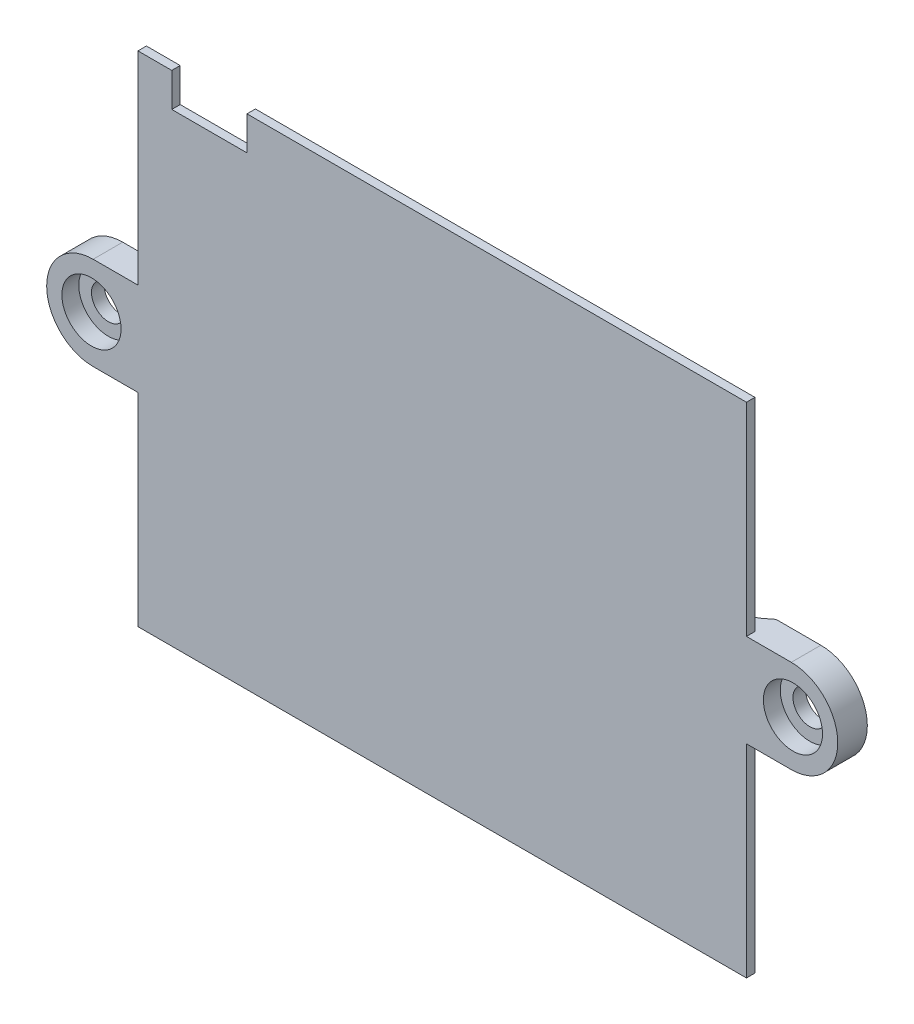
ISO-10303-21;
HEADER;
FILE_DESCRIPTION(('STEP AP214'),'2;1');
FILE_NAME('part.step','',(''),(''),'','','');
FILE_SCHEMA(('AUTOMOTIVE_DESIGN { 1 0 10303 214 1 1 1 1 }'));
ENDSEC;
DATA;
#1=APPLICATION_CONTEXT('core data for automotive mechanical design processes');
#2=APPLICATION_PROTOCOL_DEFINITION('international standard','automotive_design',2000,#1);
#3=PRODUCT_CONTEXT('',#1,'mechanical');
#4=PRODUCT('Part','Part','',(#3));
#5=PRODUCT_RELATED_PRODUCT_CATEGORY('part','',(#4));
#6=PRODUCT_DEFINITION_FORMATION('','',#4);
#7=PRODUCT_DEFINITION_CONTEXT('part definition',#1,'design');
#8=PRODUCT_DEFINITION('design','',#6,#7);
#9=PRODUCT_DEFINITION_SHAPE('','',#8);
#10=(LENGTH_UNIT() NAMED_UNIT(*) SI_UNIT(.MILLI.,.METRE.));
#11=(NAMED_UNIT(*) PLANE_ANGLE_UNIT() SI_UNIT($,.RADIAN.));
#12=(NAMED_UNIT(*) SI_UNIT($,.STERADIAN.) SOLID_ANGLE_UNIT());
#13=UNCERTAINTY_MEASURE_WITH_UNIT(LENGTH_MEASURE(1.E-05),#10,'distance_accuracy_value','');
#14=(GEOMETRIC_REPRESENTATION_CONTEXT(3) GLOBAL_UNCERTAINTY_ASSIGNED_CONTEXT((#13)) GLOBAL_UNIT_ASSIGNED_CONTEXT((#10,
#11,#12)) REPRESENTATION_CONTEXT('',''));
#15=CARTESIAN_POINT('',(0.,0.,0.));
#16=DIRECTION('',(0.,0.,1.));
#17=DIRECTION('',(1.,0.,0.));
#18=AXIS2_PLACEMENT_3D('',#15,#16,#17);
#19=CARTESIAN_POINT('',(-108.711042912636,7.30000000000003,-15.4155765380345));
#20=DIRECTION('',(0.,0.,1.));
#21=DIRECTION('',(1.,0.,0.));
#22=AXIS2_PLACEMENT_3D('',#19,#20,#21);
#23=CYLINDRICAL_SURFACE('',#22,2.);
#24=CARTESIAN_POINT('',(-108.711042912636,7.30000000000003,0.500000000000013));
#25=DIRECTION('',(0.,0.,1.));
#26=DIRECTION('',(1.,0.,0.));
#27=AXIS2_PLACEMENT_3D('',#24,#25,#26);
#28=CIRCLE('',#27,2.);
#29=CARTESIAN_POINT('',(-106.711042912636,7.30000000000003,0.500000000000013));
#30=VERTEX_POINT('',#29);
#31=EDGE_CURVE('E271',#30,#30,#28,.T.);
#32=CARTESIAN_POINT('',(-108.711042912636,7.30000000000003,2.00000000000001));
#33=DIRECTION('',(0.,0.,1.));
#34=DIRECTION('',(1.,0.,0.));
#35=AXIS2_PLACEMENT_3D('',#32,#33,#34);
#36=CIRCLE('',#35,2.);
#37=CARTESIAN_POINT('',(-106.711042912636,7.30000000000003,2.00000000000001));
#38=VERTEX_POINT('',#37);
#39=EDGE_CURVE('E68',#38,#38,#36,.T.);
#40=CARTESIAN_POINT('',(-106.711042912636,7.30000000000003,0.500000000000013));
#41=CARTESIAN_POINT('',(-106.711042912636,7.30000000000003,0.515625000000013));
#42=CARTESIAN_POINT('',(-106.711042912636,7.30000000000003,0.531250000000014));
#43=CARTESIAN_POINT('',(-106.711042912636,7.30000000000003,0.562500000000014));
#44=CARTESIAN_POINT('',(-106.711042912636,7.30000000000003,0.578125000000013));
#45=CARTESIAN_POINT('',(-106.711042912636,7.30000000000003,0.609375000000012));
#46=CARTESIAN_POINT('',(-106.711042912636,7.30000000000003,0.625000000000012));
#47=CARTESIAN_POINT('',(-106.711042912636,7.30000000000003,0.656250000000012));
#48=CARTESIAN_POINT('',(-106.711042912636,7.30000000000003,0.671875000000012));
#49=CARTESIAN_POINT('',(-106.711042912636,7.30000000000003,0.703125000000013));
#50=CARTESIAN_POINT('',(-106.711042912636,7.30000000000003,0.718750000000014));
#51=CARTESIAN_POINT('',(-106.711042912636,7.30000000000003,0.750000000000014));
#52=CARTESIAN_POINT('',(-106.711042912636,7.30000000000003,0.765625000000013));
#53=CARTESIAN_POINT('',(-106.711042912636,7.30000000000003,0.796875000000012));
#54=CARTESIAN_POINT('',(-106.711042912636,7.30000000000003,0.812500000000012));
#55=CARTESIAN_POINT('',(-106.711042912636,7.30000000000003,0.843750000000012));
#56=CARTESIAN_POINT('',(-106.711042912636,7.30000000000003,0.859375000000012));
#57=CARTESIAN_POINT('',(-106.711042912636,7.30000000000003,0.890625000000013));
#58=CARTESIAN_POINT('',(-106.711042912636,7.30000000000003,0.906250000000014));
#59=CARTESIAN_POINT('',(-106.711042912636,7.30000000000003,0.937500000000014));
#60=CARTESIAN_POINT('',(-106.711042912636,7.30000000000003,0.953125000000014));
#61=CARTESIAN_POINT('',(-106.711042912636,7.30000000000003,0.984375000000012));
#62=CARTESIAN_POINT('',(-106.711042912636,7.30000000000003,1.00000000000001));
#63=CARTESIAN_POINT('',(-106.711042912636,7.30000000000003,1.03125000000001));
#64=CARTESIAN_POINT('',(-106.711042912636,7.30000000000003,1.04687500000001));
#65=CARTESIAN_POINT('',(-106.711042912636,7.30000000000003,1.07812500000001));
#66=CARTESIAN_POINT('',(-106.711042912636,7.30000000000003,1.09375000000001));
#67=CARTESIAN_POINT('',(-106.711042912636,7.30000000000003,1.12500000000001));
#68=CARTESIAN_POINT('',(-106.711042912636,7.30000000000003,1.14062500000001));
#69=CARTESIAN_POINT('',(-106.711042912636,7.30000000000003,1.17187500000001));
#70=CARTESIAN_POINT('',(-106.711042912636,7.30000000000003,1.18750000000001));
#71=CARTESIAN_POINT('',(-106.711042912636,7.30000000000003,1.21875000000001));
#72=CARTESIAN_POINT('',(-106.711042912636,7.30000000000003,1.23437500000001));
#73=CARTESIAN_POINT('',(-106.711042912636,7.30000000000003,1.26562500000001));
#74=CARTESIAN_POINT('',(-106.711042912636,7.30000000000003,1.28125000000001));
#75=CARTESIAN_POINT('',(-106.711042912636,7.30000000000003,1.31250000000001));
#76=CARTESIAN_POINT('',(-106.711042912636,7.30000000000003,1.32812500000001));
#77=CARTESIAN_POINT('',(-106.711042912636,7.30000000000003,1.35937500000001));
#78=CARTESIAN_POINT('',(-106.711042912636,7.30000000000003,1.37500000000001));
#79=CARTESIAN_POINT('',(-106.711042912636,7.30000000000003,1.40625000000001));
#80=CARTESIAN_POINT('',(-106.711042912636,7.30000000000003,1.42187500000001));
#81=CARTESIAN_POINT('',(-106.711042912636,7.30000000000003,1.45312500000001));
#82=CARTESIAN_POINT('',(-106.711042912636,7.30000000000003,1.46875000000001));
#83=CARTESIAN_POINT('',(-106.711042912636,7.30000000000003,1.50000000000001));
#84=CARTESIAN_POINT('',(-106.711042912636,7.30000000000003,1.51562500000001));
#85=CARTESIAN_POINT('',(-106.711042912636,7.30000000000003,1.54687500000001));
#86=CARTESIAN_POINT('',(-106.711042912636,7.30000000000003,1.56250000000001));
#87=CARTESIAN_POINT('',(-106.711042912636,7.30000000000003,1.59375000000001));
#88=CARTESIAN_POINT('',(-106.711042912636,7.30000000000003,1.60937500000001));
#89=CARTESIAN_POINT('',(-106.711042912636,7.30000000000003,1.64062500000001));
#90=CARTESIAN_POINT('',(-106.711042912636,7.30000000000003,1.65625000000001));
#91=CARTESIAN_POINT('',(-106.711042912636,7.30000000000003,1.68750000000001));
#92=CARTESIAN_POINT('',(-106.711042912636,7.30000000000003,1.70312500000001));
#93=CARTESIAN_POINT('',(-106.711042912636,7.30000000000003,1.73437500000001));
#94=CARTESIAN_POINT('',(-106.711042912636,7.30000000000003,1.75000000000001));
#95=CARTESIAN_POINT('',(-106.711042912636,7.30000000000003,1.78125000000001));
#96=CARTESIAN_POINT('',(-106.711042912636,7.30000000000003,1.79687500000001));
#97=CARTESIAN_POINT('',(-106.711042912636,7.30000000000003,1.82812500000001));
#98=CARTESIAN_POINT('',(-106.711042912636,7.30000000000003,1.84375000000001));
#99=CARTESIAN_POINT('',(-106.711042912636,7.30000000000003,1.87500000000001));
#100=CARTESIAN_POINT('',(-106.711042912636,7.30000000000003,1.89062500000001));
#101=CARTESIAN_POINT('',(-106.711042912636,7.30000000000003,1.92187500000001));
#102=CARTESIAN_POINT('',(-106.711042912636,7.30000000000003,1.93750000000001));
#103=CARTESIAN_POINT('',(-106.711042912636,7.30000000000003,1.96875000000001));
#104=CARTESIAN_POINT('',(-106.711042912636,7.30000000000003,1.98437500000001));
#105=CARTESIAN_POINT('',(-106.711042912636,7.30000000000003,2.00000000000001));
#106=B_SPLINE_CURVE_WITH_KNOTS('',3,(#40,#41,#42,#43,#44,#45,#46,#47,#48,#49,#50,#51,#52,#53,
#54,#55,#56,#57,#58,#59,#60,#61,#62,#63,#64,#65,#66,#67,#68,#69,#70,#71,#72,#73,#74,#75,#76,#77,
#78,#79,#80,#81,#82,#83,#84,#85,#86,#87,#88,#89,#90,#91,#92,#93,#94,#95,#96,#97,#98,#99,#100,
#101,#102,#103,#104,#105),.UNSPECIFIED.,.F.,.F.,(4,2,2,2,2,2,2,2,2,2,2,2,2,2,2,2,2,2,2,2,2,2,2,
2,2,2,2,2,2,2,2,2,4),(0.,0.0468750000000018,0.0937500000000001,0.140624999999998,0.1875,
0.234375000000002,0.28125,0.328124999999999,0.375,0.421875000000002,0.46875,0.515624999999999,
0.5625,0.609375000000002,0.656250000000001,0.703124999999999,0.750000000000001,
0.796875000000002,0.843750000000001,0.890624999999999,0.937500000000001,0.984375000000003,
1.03125,1.078125,1.125,1.171875,1.21875,1.265625,1.3125,1.359375,1.40625,1.453125,1.5),.UNSPECIFIED.);
#107=EDGE_CURVE('BSEAM64',#30,#38,#106,.T.);
#108=ORIENTED_EDGE('',*,*,#31,.F.);
#109=ORIENTED_EDGE('',*,*,#39,.T.);
#110=ORIENTED_EDGE('',*,*,#107,.T.);
#111=ORIENTED_EDGE('',*,*,#107,.F.);
#112=EDGE_LOOP('',(#108,#110,#109,#111));
#113=FACE_BOUND('',#112,.T.);
#114=ADVANCED_FACE('F64',(#113),#23,.F.);
#115=CARTESIAN_POINT('',(-25.7110429126358,7.30000000000003,-15.4155765380345));
#116=DIRECTION('',(0.,0.,1.));
#117=DIRECTION('',(1.,0.,0.));
#118=AXIS2_PLACEMENT_3D('',#115,#116,#117);
#119=CYLINDRICAL_SURFACE('',#118,2.);
#120=CARTESIAN_POINT('',(-25.7110429126358,7.30000000000003,0.500000000000014));
#121=DIRECTION('',(0.,0.,1.));
#122=DIRECTION('',(1.,0.,0.));
#123=AXIS2_PLACEMENT_3D('',#120,#121,#122);
#124=CIRCLE('',#123,2.);
#125=CARTESIAN_POINT('',(-23.7110429126358,7.30000000000003,0.500000000000011));
#126=VERTEX_POINT('',#125);
#127=EDGE_CURVE('E224',#126,#126,#124,.T.);
#128=CARTESIAN_POINT('',(-25.7110429126358,7.30000000000003,2.00000000000002));
#129=DIRECTION('',(0.,0.,1.));
#130=DIRECTION('',(1.,0.,0.));
#131=AXIS2_PLACEMENT_3D('',#128,#129,#130);
#132=CIRCLE('',#131,2.);
#133=CARTESIAN_POINT('',(-23.7110429126358,7.30000000000003,2.00000000000001));
#134=VERTEX_POINT('',#133);
#135=EDGE_CURVE('E356',#134,#134,#132,.T.);
#136=CARTESIAN_POINT('',(-23.7110429126358,7.30000000000003,0.500000000000011));
#137=CARTESIAN_POINT('',(-23.7110429126358,7.30000000000003,0.515625000000011));
#138=CARTESIAN_POINT('',(-23.7110429126358,7.30000000000003,0.531250000000012));
#139=CARTESIAN_POINT('',(-23.7110429126358,7.30000000000003,0.562500000000012));
#140=CARTESIAN_POINT('',(-23.7110429126358,7.30000000000003,0.578125000000011));
#141=CARTESIAN_POINT('',(-23.7110429126358,7.30000000000003,0.60937500000001));
#142=CARTESIAN_POINT('',(-23.7110429126358,7.30000000000003,0.62500000000001));
#143=CARTESIAN_POINT('',(-23.7110429126358,7.30000000000003,0.65625000000001));
#144=CARTESIAN_POINT('',(-23.7110429126358,7.30000000000003,0.67187500000001));
#145=CARTESIAN_POINT('',(-23.7110429126358,7.30000000000003,0.703125000000012));
#146=CARTESIAN_POINT('',(-23.7110429126358,7.30000000000003,0.718750000000012));
#147=CARTESIAN_POINT('',(-23.7110429126358,7.30000000000003,0.750000000000012));
#148=CARTESIAN_POINT('',(-23.7110429126358,7.30000000000003,0.765625000000012));
#149=CARTESIAN_POINT('',(-23.7110429126358,7.30000000000003,0.796875000000011));
#150=CARTESIAN_POINT('',(-23.7110429126358,7.30000000000003,0.81250000000001));
#151=CARTESIAN_POINT('',(-23.7110429126358,7.30000000000003,0.84375000000001));
#152=CARTESIAN_POINT('',(-23.7110429126358,7.30000000000003,0.859375000000011));
#153=CARTESIAN_POINT('',(-23.7110429126358,7.30000000000003,0.890625000000012));
#154=CARTESIAN_POINT('',(-23.7110429126358,7.30000000000003,0.906250000000012));
#155=CARTESIAN_POINT('',(-23.7110429126358,7.30000000000003,0.937500000000012));
#156=CARTESIAN_POINT('',(-23.7110429126358,7.30000000000003,0.953125000000012));
#157=CARTESIAN_POINT('',(-23.7110429126358,7.30000000000003,0.984375000000011));
#158=CARTESIAN_POINT('',(-23.7110429126358,7.30000000000003,1.00000000000001));
#159=CARTESIAN_POINT('',(-23.7110429126358,7.30000000000003,1.03125000000001));
#160=CARTESIAN_POINT('',(-23.7110429126358,7.30000000000003,1.04687500000001));
#161=CARTESIAN_POINT('',(-23.7110429126358,7.30000000000003,1.07812500000001));
#162=CARTESIAN_POINT('',(-23.7110429126358,7.30000000000003,1.09375000000001));
#163=CARTESIAN_POINT('',(-23.7110429126358,7.30000000000003,1.12500000000001));
#164=CARTESIAN_POINT('',(-23.7110429126358,7.30000000000003,1.14062500000001));
#165=CARTESIAN_POINT('',(-23.7110429126358,7.30000000000003,1.17187500000001));
#166=CARTESIAN_POINT('',(-23.7110429126358,7.30000000000003,1.18750000000001));
#167=CARTESIAN_POINT('',(-23.7110429126358,7.30000000000003,1.21875000000001));
#168=CARTESIAN_POINT('',(-23.7110429126358,7.30000000000003,1.23437500000001));
#169=CARTESIAN_POINT('',(-23.7110429126358,7.30000000000003,1.26562500000001));
#170=CARTESIAN_POINT('',(-23.7110429126358,7.30000000000003,1.28125000000001));
#171=CARTESIAN_POINT('',(-23.7110429126358,7.30000000000003,1.31250000000001));
#172=CARTESIAN_POINT('',(-23.7110429126358,7.30000000000003,1.32812500000001));
#173=CARTESIAN_POINT('',(-23.7110429126358,7.30000000000003,1.35937500000001));
#174=CARTESIAN_POINT('',(-23.7110429126358,7.30000000000003,1.37500000000001));
#175=CARTESIAN_POINT('',(-23.7110429126358,7.30000000000003,1.40625000000001));
#176=CARTESIAN_POINT('',(-23.7110429126358,7.30000000000003,1.42187500000001));
#177=CARTESIAN_POINT('',(-23.7110429126358,7.30000000000003,1.45312500000001));
#178=CARTESIAN_POINT('',(-23.7110429126358,7.30000000000003,1.46875000000001));
#179=CARTESIAN_POINT('',(-23.7110429126358,7.30000000000003,1.50000000000001));
#180=CARTESIAN_POINT('',(-23.7110429126358,7.30000000000003,1.51562500000001));
#181=CARTESIAN_POINT('',(-23.7110429126358,7.30000000000003,1.54687500000001));
#182=CARTESIAN_POINT('',(-23.7110429126358,7.30000000000003,1.56250000000001));
#183=CARTESIAN_POINT('',(-23.7110429126358,7.30000000000003,1.59375000000001));
#184=CARTESIAN_POINT('',(-23.7110429126358,7.30000000000003,1.60937500000001));
#185=CARTESIAN_POINT('',(-23.7110429126358,7.30000000000003,1.64062500000001));
#186=CARTESIAN_POINT('',(-23.7110429126358,7.30000000000003,1.65625000000001));
#187=CARTESIAN_POINT('',(-23.7110429126358,7.30000000000003,1.68750000000001));
#188=CARTESIAN_POINT('',(-23.7110429126358,7.30000000000003,1.70312500000001));
#189=CARTESIAN_POINT('',(-23.7110429126358,7.30000000000003,1.73437500000001));
#190=CARTESIAN_POINT('',(-23.7110429126358,7.30000000000003,1.75000000000001));
#191=CARTESIAN_POINT('',(-23.7110429126358,7.30000000000003,1.78125000000001));
#192=CARTESIAN_POINT('',(-23.7110429126358,7.30000000000003,1.79687500000001));
#193=CARTESIAN_POINT('',(-23.7110429126358,7.30000000000003,1.82812500000001));
#194=CARTESIAN_POINT('',(-23.7110429126358,7.30000000000003,1.84375000000001));
#195=CARTESIAN_POINT('',(-23.7110429126358,7.30000000000003,1.87500000000001));
#196=CARTESIAN_POINT('',(-23.7110429126358,7.30000000000003,1.89062500000001));
#197=CARTESIAN_POINT('',(-23.7110429126358,7.30000000000003,1.92187500000001));
#198=CARTESIAN_POINT('',(-23.7110429126358,7.30000000000003,1.93750000000001));
#199=CARTESIAN_POINT('',(-23.7110429126358,7.30000000000003,1.96875000000001));
#200=CARTESIAN_POINT('',(-23.7110429126358,7.30000000000003,1.98437500000001));
#201=CARTESIAN_POINT('',(-23.7110429126358,7.30000000000003,2.00000000000001));
#202=B_SPLINE_CURVE_WITH_KNOTS('',3,(#136,#137,#138,#139,#140,#141,#142,#143,#144,#145,#146,
#147,#148,#149,#150,#151,#152,#153,#154,#155,#156,#157,#158,#159,#160,#161,#162,#163,#164,#165,
#166,#167,#168,#169,#170,#171,#172,#173,#174,#175,#176,#177,#178,#179,#180,#181,#182,#183,#184,
#185,#186,#187,#188,#189,#190,#191,#192,#193,#194,#195,#196,#197,#198,#199,#200,#201),
.UNSPECIFIED.,.F.,.F.,(4,2,2,2,2,2,2,2,2,2,2,2,2,2,2,2,2,2,2,2,2,2,2,2,2,2,2,2,2,2,2,2,4),(0.,
0.0468750000000018,0.0937500000000001,0.140624999999998,0.1875,0.234375000000002,0.28125,
0.328124999999999,0.375,0.421875000000002,0.46875,0.515624999999999,0.5625,0.609375000000002,
0.656250000000001,0.703124999999999,0.750000000000001,0.796875000000002,0.843750000000001,
0.890624999999999,0.937500000000001,0.984375000000003,1.03125,1.078125,1.125,1.171875,1.21875,
1.265625,1.3125,1.359375,1.40625,1.453125,1.5),.UNSPECIFIED.);
#203=EDGE_CURVE('BSEAM457',#126,#134,#202,.T.);
#204=ORIENTED_EDGE('',*,*,#127,.F.);
#205=ORIENTED_EDGE('',*,*,#135,.T.);
#206=ORIENTED_EDGE('',*,*,#203,.T.);
#207=ORIENTED_EDGE('',*,*,#203,.F.);
#208=EDGE_LOOP('',(#204,#206,#205,#207));
#209=FACE_BOUND('',#208,.T.);
#210=ADVANCED_FACE('F457',(#209),#119,.F.);
#211=CARTESIAN_POINT('',(-31.2110429126358,38.49011,3.00000000000001));
#212=DIRECTION('',(1.,0.,0.));
#213=DIRECTION('',(0.,0.,-1.));
#214=AXIS2_PLACEMENT_3D('',#211,#212,#213);
#215=PLANE('',#214);
#216=DIRECTION('',(0.,1.,0.));
#217=VECTOR('',#216,1.);
#218=CARTESIAN_POINT('',(-31.2110429126358,38.49011,3.00000000000001));
#219=LINE('',#218,#217);
#220=CARTESIAN_POINT('',(-31.2110429126358,-22.2,3.00000000000001));
#221=VERTEX_POINT('',#220);
#222=CARTESIAN_POINT('',(-31.2110429126358,1.80000000000004,3.));
#223=VERTEX_POINT('',#222);
#224=EDGE_CURVE('E290',#221,#223,#219,.T.);
#225=ORIENTED_EDGE('',*,*,#224,.T.);
#226=DIRECTION('',(0.,0.,1.));
#227=VECTOR('',#226,1.);
#228=CARTESIAN_POINT('',(-31.2110429126358,1.80000000000004,-15.4155765380345));
#229=LINE('',#228,#227);
#230=CARTESIAN_POINT('',(-31.2110429126358,1.80000000000004,4.00000000000001));
#231=VERTEX_POINT('',#230);
#232=EDGE_CURVE('E262',#223,#231,#229,.T.);
#233=ORIENTED_EDGE('',*,*,#232,.T.);
#234=DIRECTION('',(0.,1.,0.));
#235=VECTOR('',#234,1.);
#236=CARTESIAN_POINT('',(-31.2110429126358,38.49011,4.00000000000001));
#237=LINE('',#236,#235);
#238=CARTESIAN_POINT('',(-31.2110429126358,-22.2,4.00000000000001));
#239=VERTEX_POINT('',#238);
#240=EDGE_CURVE('E314',#239,#231,#237,.T.);
#241=ORIENTED_EDGE('',*,*,#240,.F.);
#242=DIRECTION('',(0.,0.,1.));
#243=VECTOR('',#242,1.);
#244=CARTESIAN_POINT('',(-31.2110429126358,-22.2,3.00000000000001));
#245=LINE('',#244,#243);
#246=EDGE_CURVE('E326',#221,#239,#245,.T.);
#247=ORIENTED_EDGE('',*,*,#246,.F.);
#248=EDGE_LOOP('',(#225,#233,#241,#247));
#249=FACE_BOUND('',#248,.T.);
#250=ADVANCED_FACE('F439',(#249),#215,.T.);
#251=CARTESIAN_POINT('',(-103.211042912636,38.49011,3.));
#252=DIRECTION('',(1.,0.,0.));
#253=DIRECTION('',(0.,0.,-1.));
#254=AXIS2_PLACEMENT_3D('',#251,#252,#253);
#255=PLANE('',#254);
#256=DIRECTION('',(0.,0.,1.));
#257=VECTOR('',#256,1.);
#258=CARTESIAN_POINT('',(-103.211042912636,1.80000000000004,-15.4155765380345));
#259=LINE('',#258,#257);
#260=CARTESIAN_POINT('',(-103.211042912636,1.80000000000004,3.));
#261=VERTEX_POINT('',#260);
#262=CARTESIAN_POINT('',(-103.211042912636,1.80000000000004,4.));
#263=VERTEX_POINT('',#262);
#264=EDGE_CURVE('E254',#261,#263,#259,.T.);
#265=ORIENTED_EDGE('',*,*,#264,.F.);
#266=DIRECTION('',(0.,1.,0.));
#267=VECTOR('',#266,1.);
#268=CARTESIAN_POINT('',(-103.211042912636,38.49011,3.));
#269=LINE('',#268,#267);
#270=CARTESIAN_POINT('',(-103.211042912636,-22.2,3.));
#271=VERTEX_POINT('',#270);
#272=EDGE_CURVE('E297',#271,#261,#269,.T.);
#273=ORIENTED_EDGE('',*,*,#272,.F.);
#274=DIRECTION('',(0.,0.,1.));
#275=VECTOR('',#274,1.);
#276=CARTESIAN_POINT('',(-103.211042912636,-22.2,3.));
#277=LINE('',#276,#275);
#278=CARTESIAN_POINT('',(-103.211042912636,-22.2,4.));
#279=VERTEX_POINT('',#278);
#280=EDGE_CURVE('E324',#271,#279,#277,.T.);
#281=ORIENTED_EDGE('',*,*,#280,.T.);
#282=DIRECTION('',(0.,1.,0.));
#283=VECTOR('',#282,1.);
#284=CARTESIAN_POINT('',(-103.211042912636,38.49011,4.));
#285=LINE('',#284,#283);
#286=EDGE_CURVE('E279',#279,#263,#285,.T.);
#287=ORIENTED_EDGE('',*,*,#286,.T.);
#288=EDGE_LOOP('',(#265,#273,#281,#287));
#289=FACE_BOUND('',#288,.T.);
#290=ADVANCED_FACE('F433',(#289),#255,.F.);
#291=CARTESIAN_POINT('',(-97.7110429126358,36.8,3.));
#292=DIRECTION('',(0.,-1.,0.));
#293=DIRECTION('',(0.,0.,-1.));
#294=AXIS2_PLACEMENT_3D('',#291,#292,#293);
#295=PLANE('',#294);
#296=DIRECTION('',(1.,0.,0.));
#297=VECTOR('',#296,1.);
#298=CARTESIAN_POINT('',(-97.7110429126358,36.8,4.));
#299=LINE('',#298,#297);
#300=CARTESIAN_POINT('',(-103.211042912636,36.8,4.));
#301=VERTEX_POINT('',#300);
#302=CARTESIAN_POINT('',(-99.2110429126358,36.8,4.));
#303=VERTEX_POINT('',#302);
#304=EDGE_CURVE('E274',#301,#303,#299,.T.);
#305=ORIENTED_EDGE('',*,*,#304,.T.);
#306=DIRECTION('',(0.,0.,1.));
#307=VECTOR('',#306,1.);
#308=CARTESIAN_POINT('',(-99.2110429126358,36.8,3.));
#309=LINE('',#308,#307);
#310=CARTESIAN_POINT('',(-99.2110429126358,36.8,3.));
#311=VERTEX_POINT('',#310);
#312=EDGE_CURVE('E257',#311,#303,#309,.T.);
#313=ORIENTED_EDGE('',*,*,#312,.F.);
#314=DIRECTION('',(1.,0.,0.));
#315=VECTOR('',#314,1.);
#316=CARTESIAN_POINT('',(-97.7110429126358,36.8,3.));
#317=LINE('',#316,#315);
#318=CARTESIAN_POINT('',(-103.211042912636,36.8,3.));
#319=VERTEX_POINT('',#318);
#320=EDGE_CURVE('E275',#319,#311,#317,.T.);
#321=ORIENTED_EDGE('',*,*,#320,.F.);
#322=DIRECTION('',(0.,0.,1.));
#323=VECTOR('',#322,1.);
#324=CARTESIAN_POINT('',(-103.211042912636,36.8,3.));
#325=LINE('',#324,#323);
#326=EDGE_CURVE('E299',#319,#301,#325,.T.);
#327=ORIENTED_EDGE('',*,*,#326,.T.);
#328=EDGE_LOOP('',(#305,#313,#321,#327));
#329=FACE_BOUND('',#328,.T.);
#330=ADVANCED_FACE('F410',(#329),#295,.F.);
#331=CARTESIAN_POINT('',(-99.2110429126358,38.49011,3.));
#332=DIRECTION('',(-1.,0.,0.));
#333=DIRECTION('',(0.,0.,1.));
#334=AXIS2_PLACEMENT_3D('',#331,#332,#333);
#335=PLANE('',#334);
#336=DIRECTION('',(0.,-1.,0.));
#337=VECTOR('',#336,1.);
#338=CARTESIAN_POINT('',(-99.2110429126358,38.49011,4.));
#339=LINE('',#338,#337);
#340=CARTESIAN_POINT('',(-99.2110429126358,32.8,4.));
#341=VERTEX_POINT('',#340);
#342=EDGE_CURVE('E302',#303,#341,#339,.T.);
#343=ORIENTED_EDGE('',*,*,#342,.T.);
#344=DIRECTION('',(0.,0.,1.));
#345=VECTOR('',#344,1.);
#346=CARTESIAN_POINT('',(-99.2110429126358,32.8,3.));
#347=LINE('',#346,#345);
#348=CARTESIAN_POINT('',(-99.2110429126358,32.8,3.));
#349=VERTEX_POINT('',#348);
#350=EDGE_CURVE('E335',#349,#341,#347,.T.);
#351=ORIENTED_EDGE('',*,*,#350,.F.);
#352=DIRECTION('',(0.,-1.,0.));
#353=VECTOR('',#352,1.);
#354=CARTESIAN_POINT('',(-99.2110429126358,38.49011,3.));
#355=LINE('',#354,#353);
#356=EDGE_CURVE('E278',#311,#349,#355,.T.);
#357=ORIENTED_EDGE('',*,*,#356,.F.);
#358=ORIENTED_EDGE('',*,*,#312,.T.);
#359=EDGE_LOOP('',(#343,#351,#357,#358));
#360=FACE_BOUND('',#359,.T.);
#361=ADVANCED_FACE('F407',(#360),#335,.F.);
#362=CARTESIAN_POINT('',(-97.7110429126358,32.8,3.));
#363=DIRECTION('',(0.,-1.,0.));
#364=DIRECTION('',(0.,0.,-1.));
#365=AXIS2_PLACEMENT_3D('',#362,#363,#364);
#366=PLANE('',#365);
#367=DIRECTION('',(1.,0.,0.));
#368=VECTOR('',#367,1.);
#369=CARTESIAN_POINT('',(-97.7110429126358,32.8,4.));
#370=LINE('',#369,#368);
#371=CARTESIAN_POINT('',(-90.3110429126358,32.8,4.));
#372=VERTEX_POINT('',#371);
#373=EDGE_CURVE('E304',#341,#372,#370,.T.);
#374=ORIENTED_EDGE('',*,*,#373,.T.);
#375=DIRECTION('',(0.,0.,1.));
#376=VECTOR('',#375,1.);
#377=CARTESIAN_POINT('',(-90.3110429126358,32.8,3.));
#378=LINE('',#377,#376);
#379=CARTESIAN_POINT('',(-90.3110429126358,32.8,3.));
#380=VERTEX_POINT('',#379);
#381=EDGE_CURVE('E333',#380,#372,#378,.T.);
#382=ORIENTED_EDGE('',*,*,#381,.F.);
#383=DIRECTION('',(1.,0.,0.));
#384=VECTOR('',#383,1.);
#385=CARTESIAN_POINT('',(-97.7110429126358,32.8,3.));
#386=LINE('',#385,#384);
#387=EDGE_CURVE('E281',#349,#380,#386,.T.);
#388=ORIENTED_EDGE('',*,*,#387,.F.);
#389=ORIENTED_EDGE('',*,*,#350,.T.);
#390=EDGE_LOOP('',(#374,#382,#388,#389));
#391=FACE_BOUND('',#390,.T.);
#392=ADVANCED_FACE('F402',(#391),#366,.F.);
#393=CARTESIAN_POINT('',(-90.3110429126358,38.49011,3.));
#394=DIRECTION('',(-1.,0.,0.));
#395=DIRECTION('',(0.,0.,1.));
#396=AXIS2_PLACEMENT_3D('',#393,#394,#395);
#397=PLANE('',#396);
#398=DIRECTION('',(0.,-1.,0.));
#399=VECTOR('',#398,1.);
#400=CARTESIAN_POINT('',(-90.3110429126358,38.49011,4.));
#401=LINE('',#400,#399);
#402=CARTESIAN_POINT('',(-90.3110429126358,36.8,4.));
#403=VERTEX_POINT('',#402);
#404=EDGE_CURVE('E307',#403,#372,#401,.T.);
#405=ORIENTED_EDGE('',*,*,#404,.F.);
#406=DIRECTION('',(0.,0.,1.));
#407=VECTOR('',#406,1.);
#408=CARTESIAN_POINT('',(-90.3110429126358,36.8,3.));
#409=LINE('',#408,#407);
#410=CARTESIAN_POINT('',(-90.3110429126358,36.8,3.));
#411=VERTEX_POINT('',#410);
#412=EDGE_CURVE('E331',#411,#403,#409,.T.);
#413=ORIENTED_EDGE('',*,*,#412,.F.);
#414=DIRECTION('',(0.,-1.,0.));
#415=VECTOR('',#414,1.);
#416=CARTESIAN_POINT('',(-90.3110429126358,38.49011,3.));
#417=LINE('',#416,#415);
#418=EDGE_CURVE('E283',#411,#380,#417,.T.);
#419=ORIENTED_EDGE('',*,*,#418,.T.);
#420=ORIENTED_EDGE('',*,*,#381,.T.);
#421=EDGE_LOOP('',(#405,#413,#419,#420));
#422=FACE_BOUND('',#421,.T.);
#423=ADVANCED_FACE('F397',(#422),#397,.T.);
#424=CARTESIAN_POINT('',(-97.7110429126358,36.8,3.));
#425=DIRECTION('',(0.,-1.,0.));
#426=DIRECTION('',(0.,0.,-1.));
#427=AXIS2_PLACEMENT_3D('',#424,#425,#426);
#428=PLANE('',#427);
#429=DIRECTION('',(1.,0.,0.));
#430=VECTOR('',#429,1.);
#431=CARTESIAN_POINT('',(-97.7110429126358,36.8,4.));
#432=LINE('',#431,#430);
#433=CARTESIAN_POINT('',(-31.2110429126358,36.8,4.00000000000001));
#434=VERTEX_POINT('',#433);
#435=EDGE_CURVE('E310',#403,#434,#432,.T.);
#436=ORIENTED_EDGE('',*,*,#435,.T.);
#437=DIRECTION('',(0.,0.,1.));
#438=VECTOR('',#437,1.);
#439=CARTESIAN_POINT('',(-31.2110429126358,36.8,3.00000000000001));
#440=LINE('',#439,#438);
#441=CARTESIAN_POINT('',(-31.2110429126358,36.8,3.00000000000001));
#442=VERTEX_POINT('',#441);
#443=EDGE_CURVE('E328',#442,#434,#440,.T.);
#444=ORIENTED_EDGE('',*,*,#443,.F.);
#445=DIRECTION('',(1.,0.,0.));
#446=VECTOR('',#445,1.);
#447=CARTESIAN_POINT('',(-97.7110429126358,36.8,3.));
#448=LINE('',#447,#446);
#449=EDGE_CURVE('E286',#411,#442,#448,.T.);
#450=ORIENTED_EDGE('',*,*,#449,.F.);
#451=ORIENTED_EDGE('',*,*,#412,.T.);
#452=EDGE_LOOP('',(#436,#444,#450,#451));
#453=FACE_BOUND('',#452,.T.);
#454=ADVANCED_FACE('F393',(#453),#428,.F.);
#455=DIRECTION('',(0.,0.,1.));
#456=VECTOR('',#455,1.);
#457=CARTESIAN_POINT('',(-31.2110429126358,12.8000000000001,-15.4155765380345));
#458=LINE('',#457,#456);
#459=CARTESIAN_POINT('',(-31.2110429126358,12.8000000000001,3.));
#460=VERTEX_POINT('',#459);
#461=CARTESIAN_POINT('',(-31.2110429126358,12.8000000000001,4.00000000000001));
#462=VERTEX_POINT('',#461);
#463=EDGE_CURVE('E342',#460,#462,#458,.T.);
#464=ORIENTED_EDGE('',*,*,#463,.F.);
#465=EDGE_CURVE('E289',#460,#442,#219,.T.);
#466=ORIENTED_EDGE('',*,*,#465,.T.);
#467=ORIENTED_EDGE('',*,*,#443,.T.);
#468=EDGE_CURVE('E313',#462,#434,#237,.T.);
#469=ORIENTED_EDGE('',*,*,#468,.F.);
#470=EDGE_LOOP('',(#464,#466,#467,#469));
#471=FACE_BOUND('',#470,.T.);
#472=ADVANCED_FACE('F389',(#471),#215,.T.);
#473=CARTESIAN_POINT('',(-97.7110429126358,-22.2,3.));
#474=DIRECTION('',(0.,-1.,0.));
#475=DIRECTION('',(0.,0.,-1.));
#476=AXIS2_PLACEMENT_3D('',#473,#474,#475);
#477=PLANE('',#476);
#478=DIRECTION('',(1.,0.,0.));
#479=VECTOR('',#478,1.);
#480=CARTESIAN_POINT('',(-97.7110429126358,-22.2,4.));
#481=LINE('',#480,#479);
#482=EDGE_CURVE('E317',#279,#239,#481,.T.);
#483=ORIENTED_EDGE('',*,*,#482,.F.);
#484=ORIENTED_EDGE('',*,*,#280,.F.);
#485=DIRECTION('',(1.,0.,0.));
#486=VECTOR('',#485,1.);
#487=CARTESIAN_POINT('',(-97.7110429126358,-22.2,3.));
#488=LINE('',#487,#486);
#489=EDGE_CURVE('E293',#271,#221,#488,.T.);
#490=ORIENTED_EDGE('',*,*,#489,.T.);
#491=ORIENTED_EDGE('',*,*,#246,.T.);
#492=EDGE_LOOP('',(#483,#484,#490,#491));
#493=FACE_BOUND('',#492,.T.);
#494=ADVANCED_FACE('F436',(#493),#477,.T.);
#495=CARTESIAN_POINT('',(-103.211042912636,12.8,3.));
#496=VERTEX_POINT('',#495);
#497=EDGE_CURVE('E296',#496,#319,#269,.T.);
#498=ORIENTED_EDGE('',*,*,#497,.F.);
#499=DIRECTION('',(0.,0.,1.));
#500=VECTOR('',#499,1.);
#501=CARTESIAN_POINT('',(-103.211042912636,12.8,-15.4155765380345));
#502=LINE('',#501,#500);
#503=CARTESIAN_POINT('',(-103.211042912636,12.8,4.));
#504=VERTEX_POINT('',#503);
#505=EDGE_CURVE('E256',#496,#504,#502,.T.);
#506=ORIENTED_EDGE('',*,*,#505,.T.);
#507=EDGE_CURVE('E320',#504,#301,#285,.T.);
#508=ORIENTED_EDGE('',*,*,#507,.T.);
#509=ORIENTED_EDGE('',*,*,#326,.F.);
#510=EDGE_LOOP('',(#498,#506,#508,#509));
#511=FACE_BOUND('',#510,.T.);
#512=ADVANCED_FACE('F414',(#511),#255,.F.);
#513=CARTESIAN_POINT('',(0.,0.,3.00000000000001));
#514=DIRECTION('',(0.,0.,-1.));
#515=DIRECTION('',(-1.,0.,0.));
#516=AXIS2_PLACEMENT_3D('',#513,#514,#515);
#517=PLANE('',#516);
#518=ORIENTED_EDGE('',*,*,#465,.F.);
#519=DIRECTION('',(-1.,0.,0.));
#520=VECTOR('',#519,1.);
#521=CARTESIAN_POINT('',(0.,12.8000000000001,3.00000000000001));
#522=LINE('',#521,#520);
#523=CARTESIAN_POINT('',(-37.8254211902972,12.8000000000001,3.00000000000001));
#524=VERTEX_POINT('',#523);
#525=EDGE_CURVE('E88',#460,#524,#522,.T.);
#526=ORIENTED_EDGE('',*,*,#525,.T.);
#527=DIRECTION('',(0.,1.,0.));
#528=VECTOR('',#527,1.);
#529=CARTESIAN_POINT('',(-37.8254211902972,1.80000000000004,3.00000000000001));
#530=LINE('',#529,#528);
#531=CARTESIAN_POINT('',(-37.8254211902972,1.80000000000005,3.00000000000001));
#532=VERTEX_POINT('',#531);
#533=EDGE_CURVE('E349',#524,#532,#530,.F.);
#534=ORIENTED_EDGE('',*,*,#533,.T.);
#535=DIRECTION('',(1.,0.,0.));
#536=VECTOR('',#535,1.);
#537=CARTESIAN_POINT('',(-97.7110429126357,1.80000000000003,3.));
#538=LINE('',#537,#536);
#539=EDGE_CURVE('E347',#532,#223,#538,.T.);
#540=ORIENTED_EDGE('',*,*,#539,.T.);
#541=ORIENTED_EDGE('',*,*,#224,.F.);
#542=ORIENTED_EDGE('',*,*,#489,.F.);
#543=ORIENTED_EDGE('',*,*,#272,.T.);
#544=DIRECTION('',(1.,0.,0.));
#545=VECTOR('',#544,1.);
#546=CARTESIAN_POINT('',(0.,1.80000000000004,3.00000000000001));
#547=LINE('',#546,#545);
#548=CARTESIAN_POINT('',(-96.5966646349743,1.80000000000004,3.));
#549=VERTEX_POINT('',#548);
#550=EDGE_CURVE('E80',#261,#549,#547,.T.);
#551=ORIENTED_EDGE('',*,*,#550,.T.);
#552=DIRECTION('',(0.,1.,0.));
#553=VECTOR('',#552,1.);
#554=CARTESIAN_POINT('',(-96.5966646349743,12.8,3.));
#555=LINE('',#554,#553);
#556=CARTESIAN_POINT('',(-96.5966646349743,12.8,3.));
#557=VERTEX_POINT('',#556);
#558=EDGE_CURVE('E341',#549,#557,#555,.T.);
#559=ORIENTED_EDGE('',*,*,#558,.T.);
#560=DIRECTION('',(-1.,0.,0.));
#561=VECTOR('',#560,1.);
#562=CARTESIAN_POINT('',(-97.7110429126358,12.8,3.));
#563=LINE('',#562,#561);
#564=EDGE_CURVE('E345',#557,#496,#563,.T.);
#565=ORIENTED_EDGE('',*,*,#564,.T.);
#566=ORIENTED_EDGE('',*,*,#497,.T.);
#567=ORIENTED_EDGE('',*,*,#320,.T.);
#568=ORIENTED_EDGE('',*,*,#356,.T.);
#569=ORIENTED_EDGE('',*,*,#387,.T.);
#570=ORIENTED_EDGE('',*,*,#418,.F.);
#571=ORIENTED_EDGE('',*,*,#449,.T.);
#572=EDGE_LOOP('',(#518,#526,#534,#540,#541,#542,#543,#551,#559,#565,#566,#567,#568,#569,#570,#571));
#573=FACE_BOUND('',#572,.T.);
#574=ADVANCED_FACE('F444',(#573),#517,.T.);
#575=CARTESIAN_POINT('',(0.,0.,4.00000000000002));
#576=DIRECTION('',(0.,0.,-1.));
#577=DIRECTION('',(-1.,0.,0.));
#578=AXIS2_PLACEMENT_3D('',#575,#576,#577);
#579=PLANE('',#578);
#580=CARTESIAN_POINT('',(-108.711042912636,7.30000000000003,4.00000000000002));
#581=DIRECTION('',(0.,0.,1.));
#582=DIRECTION('',(1.,0.,0.));
#583=AXIS2_PLACEMENT_3D('',#580,#581,#582);
#584=CIRCLE('',#583,3.50000000000001);
#585=CARTESIAN_POINT('',(-105.211042912636,7.30000000000003,4.00000000000002));
#586=VERTEX_POINT('',#585);
#587=EDGE_CURVE('E363',#586,#586,#584,.T.);
#588=ORIENTED_EDGE('',*,*,#587,.F.);
#589=EDGE_LOOP('',(#588));
#590=FACE_BOUND('',#589,.T.);
#591=CARTESIAN_POINT('',(-25.7110429126358,7.30000000000003,4.00000000000002));
#592=DIRECTION('',(0.,0.,1.));
#593=DIRECTION('',(1.,0.,0.));
#594=AXIS2_PLACEMENT_3D('',#591,#592,#593);
#595=CIRCLE('',#594,3.5);
#596=CARTESIAN_POINT('',(-22.2110429126358,7.30000000000003,4.00000000000002));
#597=VERTEX_POINT('',#596);
#598=EDGE_CURVE('E373',#597,#597,#595,.T.);
#599=ORIENTED_EDGE('',*,*,#598,.F.);
#600=EDGE_LOOP('',(#599));
#601=FACE_BOUND('',#600,.T.);
#602=ORIENTED_EDGE('',*,*,#304,.F.);
#603=ORIENTED_EDGE('',*,*,#507,.F.);
#604=DIRECTION('',(-1.,0.,0.));
#605=VECTOR('',#604,1.);
#606=CARTESIAN_POINT('',(-97.7110429126358,12.8,4.));
#607=LINE('',#606,#605);
#608=CARTESIAN_POINT('',(-108.511042912636,12.8,4.));
#609=VERTEX_POINT('',#608);
#610=EDGE_CURVE('E241',#504,#609,#607,.T.);
#611=ORIENTED_EDGE('',*,*,#610,.T.);
#612=CARTESIAN_POINT('',(-108.511042912636,7.30000000000003,4.));
#613=DIRECTION('',(0.,0.,-1.));
#614=DIRECTION('',(-1.,0.,0.));
#615=AXIS2_PLACEMENT_3D('',#612,#613,#614);
#616=CIRCLE('',#615,5.50000000000001);
#617=CARTESIAN_POINT('',(-108.511042912636,1.80000000000004,4.));
#618=VERTEX_POINT('',#617);
#619=EDGE_CURVE('E247',#618,#609,#616,.T.);
#620=ORIENTED_EDGE('',*,*,#619,.F.);
#621=DIRECTION('',(-1.,0.,0.));
#622=VECTOR('',#621,1.);
#623=CARTESIAN_POINT('',(-97.7110429126358,1.80000000000004,4.));
#624=LINE('',#623,#622);
#625=EDGE_CURVE('E242',#263,#618,#624,.T.);
#626=ORIENTED_EDGE('',*,*,#625,.F.);
#627=ORIENTED_EDGE('',*,*,#286,.F.);
#628=ORIENTED_EDGE('',*,*,#482,.T.);
#629=ORIENTED_EDGE('',*,*,#240,.T.);
#630=DIRECTION('',(1.,0.,0.));
#631=VECTOR('',#630,1.);
#632=CARTESIAN_POINT('',(-97.7110429126357,1.80000000000003,4.));
#633=LINE('',#632,#631);
#634=CARTESIAN_POINT('',(-25.9110429126358,1.80000000000004,4.00000000000001));
#635=VERTEX_POINT('',#634);
#636=EDGE_CURVE('E231',#231,#635,#633,.T.);
#637=ORIENTED_EDGE('',*,*,#636,.T.);
#638=CARTESIAN_POINT('',(-25.9110429126358,7.30000000000004,4.00000000000001));
#639=DIRECTION('',(0.,0.,-1.));
#640=DIRECTION('',(-1.,0.,0.));
#641=AXIS2_PLACEMENT_3D('',#638,#639,#640);
#642=CIRCLE('',#641,5.50000000000001);
#643=CARTESIAN_POINT('',(-25.9110429126358,12.8000000000001,4.00000000000001));
#644=VERTEX_POINT('',#643);
#645=EDGE_CURVE('E225',#644,#635,#642,.T.);
#646=ORIENTED_EDGE('',*,*,#645,.F.);
#647=DIRECTION('',(1.,0.,0.));
#648=VECTOR('',#647,1.);
#649=CARTESIAN_POINT('',(-97.7110429126357,12.8,4.));
#650=LINE('',#649,#648);
#651=EDGE_CURVE('E216',#462,#644,#650,.T.);
#652=ORIENTED_EDGE('',*,*,#651,.F.);
#653=ORIENTED_EDGE('',*,*,#468,.T.);
#654=ORIENTED_EDGE('',*,*,#435,.F.);
#655=ORIENTED_EDGE('',*,*,#404,.T.);
#656=ORIENTED_EDGE('',*,*,#373,.F.);
#657=ORIENTED_EDGE('',*,*,#342,.F.);
#658=EDGE_LOOP('',(#602,#603,#611,#620,#626,#627,#628,#629,#637,#646,#652,#653,#654,#655,#656,#657));
#659=FACE_BOUND('',#658,.T.);
#660=ADVANCED_FACE('F387',(#590,#601,#659),#579,.F.);
#661=CARTESIAN_POINT('',(-97.7110429126358,1.80000000000004,-15.4155765380345));
#662=DIRECTION('',(0.,1.,0.));
#663=DIRECTION('',(0.,0.,1.));
#664=AXIS2_PLACEMENT_3D('',#661,#662,#663);
#665=PLANE('',#664);
#666=DIRECTION('',(0.,0.,1.));
#667=VECTOR('',#666,1.);
#668=CARTESIAN_POINT('',(-108.511042912636,1.80000000000004,-15.4155765380345));
#669=LINE('',#668,#667);
#670=CARTESIAN_POINT('',(-108.511042912636,1.80000000000003,0.500000000000013));
#671=VERTEX_POINT('',#670);
#672=EDGE_CURVE('E251',#671,#618,#669,.T.);
#673=ORIENTED_EDGE('',*,*,#672,.F.);
#674=DIRECTION('',(1.,0.,0.));
#675=VECTOR('',#674,1.);
#676=CARTESIAN_POINT('',(-97.7110429126358,1.80000000000004,0.500000000000014));
#677=LINE('',#676,#675);
#678=CARTESIAN_POINT('',(-103.211042912636,1.80000000000004,0.500000000000014));
#679=VERTEX_POINT('',#678);
#680=EDGE_CURVE('E246',#671,#679,#677,.T.);
#681=ORIENTED_EDGE('',*,*,#680,.T.);
#682=CARTESIAN_POINT('',(-96.5966646349743,1.80000000000004,-7.));
#683=DIRECTION('',(0.,1.,0.));
#684=DIRECTION('',(0.,0.,1.));
#685=AXIS2_PLACEMENT_3D('',#682,#683,#684);
#686=CIRCLE('',#685,10.);
#687=EDGE_CURVE('E13',#679,#549,#686,.T.);
#688=ORIENTED_EDGE('',*,*,#687,.T.);
#689=ORIENTED_EDGE('',*,*,#550,.F.);
#690=ORIENTED_EDGE('',*,*,#264,.T.);
#691=ORIENTED_EDGE('',*,*,#625,.T.);
#692=EDGE_LOOP('',(#673,#681,#688,#689,#690,#691));
#693=FACE_BOUND('',#692,.T.);
#694=ADVANCED_FACE('F429',(#693),#665,.F.);
#695=CARTESIAN_POINT('',(-108.511042912636,7.30000000000003,-15.4155765380345));
#696=DIRECTION('',(0.,0.,1.));
#697=DIRECTION('',(1.,0.,0.));
#698=AXIS2_PLACEMENT_3D('',#695,#696,#697);
#699=CYLINDRICAL_SURFACE('',#698,5.50000000000001);
#700=DIRECTION('',(0.,0.,1.));
#701=VECTOR('',#700,1.);
#702=CARTESIAN_POINT('',(-108.511042912636,12.8,-15.4155765380345));
#703=LINE('',#702,#701);
#704=CARTESIAN_POINT('',(-108.511042912636,12.8,0.500000000000009));
#705=VERTEX_POINT('',#704);
#706=EDGE_CURVE('E250',#705,#609,#703,.T.);
#707=ORIENTED_EDGE('',*,*,#706,.F.);
#708=CARTESIAN_POINT('',(-108.511042912636,7.30000000000003,0.500000000000013));
#709=DIRECTION('',(0.,0.,1.));
#710=DIRECTION('',(1.,0.,0.));
#711=AXIS2_PLACEMENT_3D('',#708,#709,#710);
#712=CIRCLE('',#711,5.50000000000001);
#713=EDGE_CURVE('E245',#705,#671,#712,.T.);
#714=ORIENTED_EDGE('',*,*,#713,.T.);
#715=ORIENTED_EDGE('',*,*,#672,.T.);
#716=ORIENTED_EDGE('',*,*,#619,.T.);
#717=EDGE_LOOP('',(#707,#714,#715,#716));
#718=FACE_BOUND('',#717,.T.);
#719=ADVANCED_FACE('F424',(#718),#699,.T.);
#720=CARTESIAN_POINT('',(-97.7110429126358,12.8,-15.4155765380345));
#721=DIRECTION('',(0.,1.,0.));
#722=DIRECTION('',(0.,0.,1.));
#723=AXIS2_PLACEMENT_3D('',#720,#721,#722);
#724=PLANE('',#723);
#725=DIRECTION('',(1.,0.,0.));
#726=VECTOR('',#725,1.);
#727=CARTESIAN_POINT('',(-97.7110429126358,12.8,0.500000000000014));
#728=LINE('',#727,#726);
#729=CARTESIAN_POINT('',(-103.211042912636,12.8,0.500000000000014));
#730=VERTEX_POINT('',#729);
#731=EDGE_CURVE('E264',#705,#730,#728,.T.);
#732=ORIENTED_EDGE('',*,*,#731,.F.);
#733=ORIENTED_EDGE('',*,*,#706,.T.);
#734=ORIENTED_EDGE('',*,*,#610,.F.);
#735=ORIENTED_EDGE('',*,*,#505,.F.);
#736=ORIENTED_EDGE('',*,*,#564,.F.);
#737=CARTESIAN_POINT('',(-96.5966646349743,12.8,-7.));
#738=DIRECTION('',(0.,1.,0.));
#739=DIRECTION('',(0.,0.,1.));
#740=AXIS2_PLACEMENT_3D('',#737,#738,#739);
#741=CIRCLE('',#740,10.);
#742=EDGE_CURVE('E73',#557,#730,#741,.F.);
#743=ORIENTED_EDGE('',*,*,#742,.T.);
#744=EDGE_LOOP('',(#732,#733,#734,#735,#736,#743));
#745=FACE_BOUND('',#744,.T.);
#746=ADVANCED_FACE('F420',(#745),#724,.T.);
#747=CARTESIAN_POINT('',(0.,0.,0.500000000000014));
#748=DIRECTION('',(0.,0.,1.));
#749=DIRECTION('',(1.,0.,0.));
#750=AXIS2_PLACEMENT_3D('',#747,#748,#749);
#751=PLANE('',#750);
#752=DIRECTION('',(0.,-1.,0.));
#753=VECTOR('',#752,1.);
#754=CARTESIAN_POINT('',(-103.211042912636,38.49011,0.500000000000014));
#755=LINE('',#754,#753);
#756=EDGE_CURVE('E260',#730,#679,#755,.T.);
#757=ORIENTED_EDGE('',*,*,#756,.T.);
#758=ORIENTED_EDGE('',*,*,#680,.F.);
#759=ORIENTED_EDGE('',*,*,#713,.F.);
#760=ORIENTED_EDGE('',*,*,#731,.T.);
#761=EDGE_LOOP('',(#757,#758,#759,#760));
#762=FACE_BOUND('',#761,.T.);
#763=ORIENTED_EDGE('',*,*,#31,.T.);
#764=EDGE_LOOP('',(#763));
#765=FACE_BOUND('',#764,.T.);
#766=ADVANCED_FACE('F470',(#762,#765),#751,.F.);
#767=CARTESIAN_POINT('',(-97.7110429126357,1.80000000000003,-15.4155765380345));
#768=DIRECTION('',(0.,-1.,0.));
#769=DIRECTION('',(1.,0.,0.));
#770=AXIS2_PLACEMENT_3D('',#767,#768,#769);
#771=PLANE('',#770);
#772=DIRECTION('',(-1.,0.,0.));
#773=VECTOR('',#772,1.);
#774=CARTESIAN_POINT('',(-97.7110429126357,1.80000000000003,0.500000000000014));
#775=LINE('',#774,#773);
#776=CARTESIAN_POINT('',(-25.9110429126358,1.80000000000004,0.500000000000014));
#777=VERTEX_POINT('',#776);
#778=CARTESIAN_POINT('',(-31.2110429126358,1.80000000000004,0.500000000000014));
#779=VERTEX_POINT('',#778);
#780=EDGE_CURVE('E208',#777,#779,#775,.T.);
#781=ORIENTED_EDGE('',*,*,#780,.F.);
#782=DIRECTION('',(0.,0.,1.));
#783=VECTOR('',#782,1.);
#784=CARTESIAN_POINT('',(-25.9110429126358,1.80000000000004,-15.4155765380345));
#785=LINE('',#784,#783);
#786=EDGE_CURVE('E220',#777,#635,#785,.T.);
#787=ORIENTED_EDGE('',*,*,#786,.T.);
#788=ORIENTED_EDGE('',*,*,#636,.F.);
#789=ORIENTED_EDGE('',*,*,#232,.F.);
#790=ORIENTED_EDGE('',*,*,#539,.F.);
#791=CARTESIAN_POINT('',(-37.8254211902972,1.80000000000004,-6.99999999999999));
#792=DIRECTION('',(0.,-1.,0.));
#793=DIRECTION('',(1.,0.,0.));
#794=AXIS2_PLACEMENT_3D('',#791,#792,#793);
#795=CIRCLE('',#794,10.);
#796=EDGE_CURVE('E223',#532,#779,#795,.F.);
#797=ORIENTED_EDGE('',*,*,#796,.T.);
#798=EDGE_LOOP('',(#781,#787,#788,#789,#790,#797));
#799=FACE_BOUND('',#798,.T.);
#800=ADVANCED_FACE('F219',(#799),#771,.T.);
#801=CARTESIAN_POINT('',(-97.7110429126357,12.8,-15.4155765380345));
#802=DIRECTION('',(0.,-1.,0.));
#803=DIRECTION('',(1.,0.,0.));
#804=AXIS2_PLACEMENT_3D('',#801,#802,#803);
#805=PLANE('',#804);
#806=DIRECTION('',(0.,0.,1.));
#807=VECTOR('',#806,1.);
#808=CARTESIAN_POINT('',(-25.9110429126358,12.8000000000001,-15.4155765380345));
#809=LINE('',#808,#807);
#810=CARTESIAN_POINT('',(-25.9110429126358,12.8000000000001,0.500000000000007));
#811=VERTEX_POINT('',#810);
#812=EDGE_CURVE('E215',#811,#644,#809,.T.);
#813=ORIENTED_EDGE('',*,*,#812,.F.);
#814=DIRECTION('',(-1.,0.,0.));
#815=VECTOR('',#814,1.);
#816=CARTESIAN_POINT('',(-97.7110429126357,12.8,0.500000000000014));
#817=LINE('',#816,#815);
#818=CARTESIAN_POINT('',(-31.2110429126358,12.8000000000001,0.500000000000014));
#819=VERTEX_POINT('',#818);
#820=EDGE_CURVE('E211',#811,#819,#817,.T.);
#821=ORIENTED_EDGE('',*,*,#820,.T.);
#822=CARTESIAN_POINT('',(-37.8254211902972,12.8000000000001,-6.99999999999999));
#823=DIRECTION('',(0.,-1.,0.));
#824=DIRECTION('',(1.,0.,0.));
#825=AXIS2_PLACEMENT_3D('',#822,#823,#824);
#826=CIRCLE('',#825,10.);
#827=EDGE_CURVE('E353',#819,#524,#826,.T.);
#828=ORIENTED_EDGE('',*,*,#827,.T.);
#829=ORIENTED_EDGE('',*,*,#525,.F.);
#830=ORIENTED_EDGE('',*,*,#463,.T.);
#831=ORIENTED_EDGE('',*,*,#651,.T.);
#832=EDGE_LOOP('',(#813,#821,#828,#829,#830,#831));
#833=FACE_BOUND('',#832,.T.);
#834=ADVANCED_FACE('F382',(#833),#805,.F.);
#835=CARTESIAN_POINT('',(-25.9110429126358,7.30000000000004,-15.4155765380345));
#836=DIRECTION('',(0.,0.,1.));
#837=DIRECTION('',(1.,0.,0.));
#838=AXIS2_PLACEMENT_3D('',#835,#836,#837);
#839=CYLINDRICAL_SURFACE('',#838,5.50000000000001);
#840=ORIENTED_EDGE('',*,*,#786,.F.);
#841=CARTESIAN_POINT('',(-25.9110429126358,7.30000000000004,0.500000000000014));
#842=DIRECTION('',(0.,0.,1.));
#843=DIRECTION('',(1.,0.,0.));
#844=AXIS2_PLACEMENT_3D('',#841,#842,#843);
#845=CIRCLE('',#844,5.50000000000001);
#846=EDGE_CURVE('E203',#777,#811,#845,.T.);
#847=ORIENTED_EDGE('',*,*,#846,.T.);
#848=ORIENTED_EDGE('',*,*,#812,.T.);
#849=ORIENTED_EDGE('',*,*,#645,.T.);
#850=EDGE_LOOP('',(#840,#847,#848,#849));
#851=FACE_BOUND('',#850,.T.);
#852=ADVANCED_FACE('F227',(#851),#839,.T.);
#853=CARTESIAN_POINT('',(0.,0.,0.500000000000014));
#854=DIRECTION('',(0.,0.,1.));
#855=DIRECTION('',(1.,0.,0.));
#856=AXIS2_PLACEMENT_3D('',#853,#854,#855);
#857=PLANE('',#856);
#858=ORIENTED_EDGE('',*,*,#780,.T.);
#859=DIRECTION('',(0.,-1.,0.));
#860=VECTOR('',#859,1.);
#861=CARTESIAN_POINT('',(-31.2110429126358,38.49011,0.500000000000014));
#862=LINE('',#861,#860);
#863=EDGE_CURVE('E230',#819,#779,#862,.T.);
#864=ORIENTED_EDGE('',*,*,#863,.F.);
#865=ORIENTED_EDGE('',*,*,#820,.F.);
#866=ORIENTED_EDGE('',*,*,#846,.F.);
#867=EDGE_LOOP('',(#858,#864,#865,#866));
#868=FACE_BOUND('',#867,.T.);
#869=ORIENTED_EDGE('',*,*,#127,.T.);
#870=EDGE_LOOP('',(#869));
#871=FACE_BOUND('',#870,.T.);
#872=ADVANCED_FACE('F205',(#868,#871),#857,.F.);
#873=CARTESIAN_POINT('',(-37.8254211902972,38.49011,-6.99999999999999));
#874=DIRECTION('',(0.,-1.,0.));
#875=DIRECTION('',(0.,0.,-1.));
#876=AXIS2_PLACEMENT_3D('',#873,#874,#875);
#877=CYLINDRICAL_SURFACE('',#876,10.);
#878=ORIENTED_EDGE('',*,*,#796,.F.);
#879=ORIENTED_EDGE('',*,*,#533,.F.);
#880=ORIENTED_EDGE('',*,*,#827,.F.);
#881=ORIENTED_EDGE('',*,*,#863,.T.);
#882=EDGE_LOOP('',(#878,#879,#880,#881));
#883=FACE_BOUND('',#882,.T.);
#884=ADVANCED_FACE('F446',(#883),#877,.F.);
#885=CARTESIAN_POINT('',(-96.5966646349743,38.49011,-7.));
#886=DIRECTION('',(0.,-1.,0.));
#887=DIRECTION('',(0.,0.,-1.));
#888=AXIS2_PLACEMENT_3D('',#885,#886,#887);
#889=CYLINDRICAL_SURFACE('',#888,10.);
#890=ORIENTED_EDGE('',*,*,#687,.F.);
#891=ORIENTED_EDGE('',*,*,#756,.F.);
#892=ORIENTED_EDGE('',*,*,#742,.F.);
#893=ORIENTED_EDGE('',*,*,#558,.F.);
#894=EDGE_LOOP('',(#890,#891,#892,#893));
#895=FACE_BOUND('',#894,.T.);
#896=ADVANCED_FACE('F66',(#895),#889,.F.);
#897=CARTESIAN_POINT('',(-25.7110429126358,7.30000000000003,2.00000000000001));
#898=DIRECTION('',(0.,0.,1.));
#899=DIRECTION('',(1.,0.,0.));
#900=AXIS2_PLACEMENT_3D('',#897,#898,#899);
#901=CYLINDRICAL_SURFACE('',#900,3.5);
#902=CARTESIAN_POINT('',(-25.7110429126358,7.30000000000003,2.00000000000001));
#903=DIRECTION('',(0.,0.,1.));
#904=DIRECTION('',(1.,0.,0.));
#905=AXIS2_PLACEMENT_3D('',#902,#903,#904);
#906=CIRCLE('',#905,3.5);
#907=CARTESIAN_POINT('',(-22.2110429126358,7.30000000000003,2.00000000000001));
#908=VERTEX_POINT('',#907);
#909=EDGE_CURVE('E368',#908,#908,#906,.T.);
#910=ORIENTED_EDGE('',*,*,#909,.F.);
#911=EDGE_LOOP('',(#910));
#912=FACE_BOUND('',#911,.T.);
#913=ORIENTED_EDGE('',*,*,#598,.T.);
#914=EDGE_LOOP('',(#913));
#915=FACE_BOUND('',#914,.T.);
#916=ADVANCED_FACE('F452',(#912,#915),#901,.F.);
#917=CARTESIAN_POINT('',(-25.7110429126358,7.30000000000003,2.00000000000001));
#918=DIRECTION('',(0.,0.,1.));
#919=DIRECTION('',(1.,0.,0.));
#920=AXIS2_PLACEMENT_3D('',#917,#918,#919);
#921=PLANE('',#920);
#922=ORIENTED_EDGE('',*,*,#135,.F.);
#923=EDGE_LOOP('',(#922));
#924=FACE_BOUND('',#923,.T.);
#925=ORIENTED_EDGE('',*,*,#909,.T.);
#926=EDGE_LOOP('',(#925));
#927=FACE_BOUND('',#926,.T.);
#928=ADVANCED_FACE('F528',(#924,#927),#921,.T.);
#929=CARTESIAN_POINT('',(-108.711042912636,7.30000000000003,2.00000000000001));
#930=DIRECTION('',(0.,0.,1.));
#931=DIRECTION('',(1.,0.,0.));
#932=AXIS2_PLACEMENT_3D('',#929,#930,#931);
#933=CYLINDRICAL_SURFACE('',#932,3.50000000000001);
#934=CARTESIAN_POINT('',(-108.711042912636,7.30000000000003,2.00000000000001));
#935=DIRECTION('',(0.,0.,1.));
#936=DIRECTION('',(1.,0.,0.));
#937=AXIS2_PLACEMENT_3D('',#934,#935,#936);
#938=CIRCLE('',#937,3.50000000000001);
#939=CARTESIAN_POINT('',(-105.211042912636,7.30000000000003,2.00000000000001));
#940=VERTEX_POINT('',#939);
#941=EDGE_CURVE('E358',#940,#940,#938,.T.);
#942=ORIENTED_EDGE('',*,*,#941,.F.);
#943=EDGE_LOOP('',(#942));
#944=FACE_BOUND('',#943,.T.);
#945=ORIENTED_EDGE('',*,*,#587,.T.);
#946=EDGE_LOOP('',(#945));
#947=FACE_BOUND('',#946,.T.);
#948=ADVANCED_FACE('F538',(#944,#947),#933,.F.);
#949=CARTESIAN_POINT('',(-108.711042912636,7.30000000000003,2.00000000000001));
#950=DIRECTION('',(0.,0.,1.));
#951=DIRECTION('',(1.,0.,0.));
#952=AXIS2_PLACEMENT_3D('',#949,#950,#951);
#953=PLANE('',#952);
#954=ORIENTED_EDGE('',*,*,#39,.F.);
#955=EDGE_LOOP('',(#954));
#956=FACE_BOUND('',#955,.T.);
#957=ORIENTED_EDGE('',*,*,#941,.T.);
#958=EDGE_LOOP('',(#957));
#959=FACE_BOUND('',#958,.T.);
#960=ADVANCED_FACE('F548',(#956,#959),#953,.T.);
#961=CLOSED_SHELL('',(#114,#210,#250,#290,#330,#361,#392,#423,#454,#472,#494,#512,#574,#660,
#694,#719,#746,#766,#800,#834,#852,#872,#884,#896,#916,#928,#948,#960));
#962=MANIFOLD_SOLID_BREP('B2',#961);
#963=ADVANCED_BREP_SHAPE_REPRESENTATION('',(#18,#962),#14);
#964=SHAPE_DEFINITION_REPRESENTATION(#9,#963);
ENDSEC;
END-ISO-10303-21;
